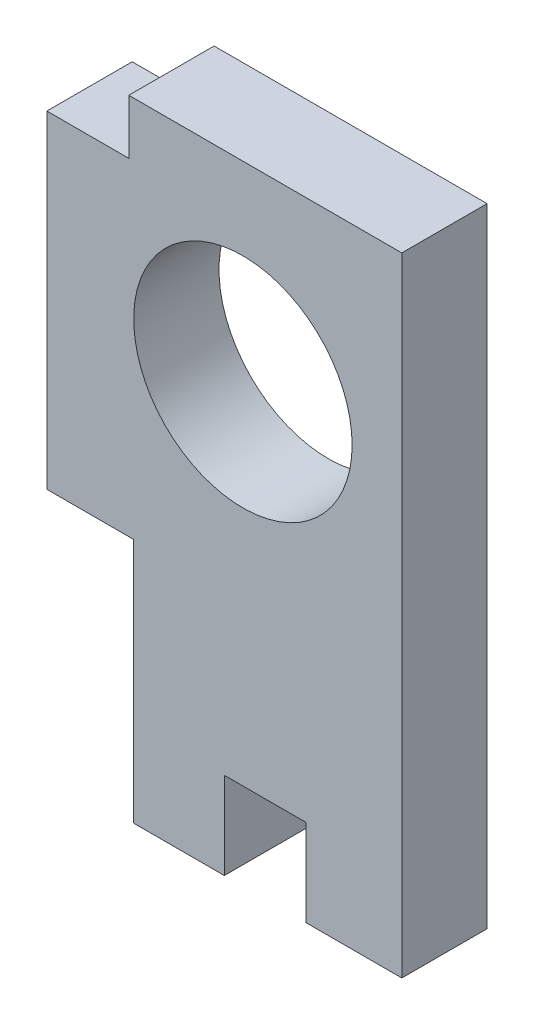
ISO-10303-21;
HEADER;
FILE_DESCRIPTION(('STEP AP214'),'2;1');
FILE_NAME('part.step','',(''),(''),'','','');
FILE_SCHEMA(('AUTOMOTIVE_DESIGN { 1 0 10303 214 1 1 1 1 }'));
ENDSEC;
DATA;
#1=APPLICATION_CONTEXT('core data for automotive mechanical design processes');
#2=APPLICATION_PROTOCOL_DEFINITION('international standard','automotive_design',2000,#1);
#3=PRODUCT_CONTEXT('',#1,'mechanical');
#4=PRODUCT('Part','Part','',(#3));
#5=PRODUCT_RELATED_PRODUCT_CATEGORY('part','',(#4));
#6=PRODUCT_DEFINITION_FORMATION('','',#4);
#7=PRODUCT_DEFINITION_CONTEXT('part definition',#1,'design');
#8=PRODUCT_DEFINITION('design','',#6,#7);
#9=PRODUCT_DEFINITION_SHAPE('','',#8);
#10=(LENGTH_UNIT() NAMED_UNIT(*) SI_UNIT(.MILLI.,.METRE.));
#11=(NAMED_UNIT(*) PLANE_ANGLE_UNIT() SI_UNIT($,.RADIAN.));
#12=(NAMED_UNIT(*) SI_UNIT($,.STERADIAN.) SOLID_ANGLE_UNIT());
#13=UNCERTAINTY_MEASURE_WITH_UNIT(LENGTH_MEASURE(1.E-05),#10,'distance_accuracy_value','');
#14=(GEOMETRIC_REPRESENTATION_CONTEXT(3) GLOBAL_UNCERTAINTY_ASSIGNED_CONTEXT((#13)) GLOBAL_UNIT_ASSIGNED_CONTEXT((#10,
#11,#12)) REPRESENTATION_CONTEXT('',''));
#15=CARTESIAN_POINT('',(0.,0.,0.));
#16=DIRECTION('',(0.,0.,1.));
#17=DIRECTION('',(1.,0.,0.));
#18=AXIS2_PLACEMENT_3D('',#15,#16,#17);
#19=CARTESIAN_POINT('',(0.,0.,3.125));
#20=DIRECTION('',(0.,0.,-1.));
#21=DIRECTION('',(-1.,0.,0.));
#22=AXIS2_PLACEMENT_3D('',#19,#20,#21);
#23=PLANE('',#22);
#24=DIRECTION('',(1.,0.,0.));
#25=VECTOR('',#24,1.);
#26=CARTESIAN_POINT('',(13.,-11.5,3.125));
#27=LINE('',#26,#25);
#28=CARTESIAN_POINT('',(9.5,-11.5,3.125));
#29=VERTEX_POINT('',#28);
#30=CARTESIAN_POINT('',(13.,-11.5,3.125));
#31=VERTEX_POINT('',#30);
#32=EDGE_CURVE('E200',#29,#31,#27,.T.);
#33=ORIENTED_EDGE('',*,*,#32,.T.);
#34=DIRECTION('',(0.,1.,0.));
#35=VECTOR('',#34,1.);
#36=CARTESIAN_POINT('',(13.,11.5,3.125));
#37=LINE('',#36,#35);
#38=CARTESIAN_POINT('',(13.,11.5,3.125));
#39=VERTEX_POINT('',#38);
#40=EDGE_CURVE('E112',#31,#39,#37,.T.);
#41=ORIENTED_EDGE('',*,*,#40,.T.);
#42=DIRECTION('',(-1.,0.,0.));
#43=VECTOR('',#42,1.);
#44=CARTESIAN_POINT('',(2.99999999999999,11.5,3.125));
#45=LINE('',#44,#43);
#46=CARTESIAN_POINT('',(2.99999999999999,11.5,3.125));
#47=VERTEX_POINT('',#46);
#48=EDGE_CURVE('E237',#39,#47,#45,.T.);
#49=ORIENTED_EDGE('',*,*,#48,.T.);
#50=DIRECTION('',(0.,-1.,0.));
#51=VECTOR('',#50,1.);
#52=CARTESIAN_POINT('',(2.99999999999999,9.5,3.125));
#53=LINE('',#52,#51);
#54=CARTESIAN_POINT('',(2.99999999999999,9.5,3.125));
#55=VERTEX_POINT('',#54);
#56=EDGE_CURVE('E257',#47,#55,#53,.T.);
#57=ORIENTED_EDGE('',*,*,#56,.T.);
#58=DIRECTION('',(-1.,0.,0.));
#59=VECTOR('',#58,1.);
#60=CARTESIAN_POINT('',(0.,9.5,3.125));
#61=LINE('',#60,#59);
#62=CARTESIAN_POINT('',(0.,9.5,3.125));
#63=VERTEX_POINT('',#62);
#64=EDGE_CURVE('E253',#55,#63,#61,.T.);
#65=ORIENTED_EDGE('',*,*,#64,.T.);
#66=DIRECTION('',(0.,-1.,0.));
#67=VECTOR('',#66,1.);
#68=CARTESIAN_POINT('',(0.,9.5,3.125));
#69=LINE('',#68,#67);
#70=CARTESIAN_POINT('',(0.,-2.5,3.125));
#71=VERTEX_POINT('',#70);
#72=EDGE_CURVE('E256',#63,#71,#69,.T.);
#73=ORIENTED_EDGE('',*,*,#72,.T.);
#74=DIRECTION('',(1.,0.,0.));
#75=VECTOR('',#74,1.);
#76=CARTESIAN_POINT('',(3.18,-2.5,3.125));
#77=LINE('',#76,#75);
#78=CARTESIAN_POINT('',(3.18,-2.5,3.125));
#79=VERTEX_POINT('',#78);
#80=EDGE_CURVE('E261',#71,#79,#77,.T.);
#81=ORIENTED_EDGE('',*,*,#80,.T.);
#82=DIRECTION('',(0.,-1.,0.));
#83=VECTOR('',#82,1.);
#84=CARTESIAN_POINT('',(3.18,-11.5,3.125));
#85=LINE('',#84,#83);
#86=CARTESIAN_POINT('',(3.18,-11.5,3.125));
#87=VERTEX_POINT('',#86);
#88=EDGE_CURVE('E268',#79,#87,#85,.T.);
#89=ORIENTED_EDGE('',*,*,#88,.T.);
#90=DIRECTION('',(1.,0.,0.));
#91=VECTOR('',#90,1.);
#92=CARTESIAN_POINT('',(6.5,-11.5,3.125));
#93=LINE('',#92,#91);
#94=CARTESIAN_POINT('',(6.5,-11.5,3.125));
#95=VERTEX_POINT('',#94);
#96=EDGE_CURVE('E143',#87,#95,#93,.T.);
#97=ORIENTED_EDGE('',*,*,#96,.T.);
#98=DIRECTION('',(0.,1.,0.));
#99=VECTOR('',#98,1.);
#100=CARTESIAN_POINT('',(6.5,-8.32,3.125));
#101=LINE('',#100,#99);
#102=CARTESIAN_POINT('',(6.5,-8.32,3.125));
#103=VERTEX_POINT('',#102);
#104=EDGE_CURVE('E137',#95,#103,#101,.T.);
#105=ORIENTED_EDGE('',*,*,#104,.T.);
#106=DIRECTION('',(1.,0.,0.));
#107=VECTOR('',#106,1.);
#108=CARTESIAN_POINT('',(9.5,-8.32,3.125));
#109=LINE('',#108,#107);
#110=CARTESIAN_POINT('',(9.5,-8.32,3.125));
#111=VERTEX_POINT('',#110);
#112=EDGE_CURVE('E141',#103,#111,#109,.T.);
#113=ORIENTED_EDGE('',*,*,#112,.T.);
#114=DIRECTION('',(0.,-1.,0.));
#115=VECTOR('',#114,1.);
#116=CARTESIAN_POINT('',(9.5,-11.5,3.125));
#117=LINE('',#116,#115);
#118=EDGE_CURVE('E57',#111,#29,#117,.T.);
#119=ORIENTED_EDGE('',*,*,#118,.T.);
#120=EDGE_LOOP('',(#33,#41,#49,#57,#65,#73,#81,#89,#97,#105,#113,#119));
#121=FACE_BOUND('',#120,.T.);
#122=CARTESIAN_POINT('',(7.18,4.5,3.125));
#123=DIRECTION('',(0.,0.,1.));
#124=DIRECTION('',(1.,0.,0.));
#125=AXIS2_PLACEMENT_3D('',#122,#123,#124);
#126=CIRCLE('',#125,4.);
#127=CARTESIAN_POINT('',(11.18,4.5,3.125));
#128=VERTEX_POINT('',#127);
#129=EDGE_CURVE('E170',#128,#128,#126,.T.);
#130=ORIENTED_EDGE('',*,*,#129,.F.);
#131=EDGE_LOOP('',(#130));
#132=FACE_BOUND('',#131,.T.);
#133=ADVANCED_FACE('F39',(#121,#132),#23,.F.);
#134=CARTESIAN_POINT('',(0.,0.,0.));
#135=DIRECTION('',(0.,0.,-1.));
#136=DIRECTION('',(-1.,0.,0.));
#137=AXIS2_PLACEMENT_3D('',#134,#135,#136);
#138=PLANE('',#137);
#139=DIRECTION('',(1.,0.,0.));
#140=VECTOR('',#139,1.);
#141=CARTESIAN_POINT('',(13.,-11.5,0.));
#142=LINE('',#141,#140);
#143=CARTESIAN_POINT('',(9.5,-11.5,0.));
#144=VERTEX_POINT('',#143);
#145=CARTESIAN_POINT('',(13.,-11.5,0.));
#146=VERTEX_POINT('',#145);
#147=EDGE_CURVE('E165',#144,#146,#142,.T.);
#148=ORIENTED_EDGE('',*,*,#147,.F.);
#149=DIRECTION('',(0.,-1.,0.));
#150=VECTOR('',#149,1.);
#151=CARTESIAN_POINT('',(9.5,-11.5,0.));
#152=LINE('',#151,#150);
#153=CARTESIAN_POINT('',(9.5,-8.32,0.));
#154=VERTEX_POINT('',#153);
#155=EDGE_CURVE('E104',#154,#144,#152,.T.);
#156=ORIENTED_EDGE('',*,*,#155,.F.);
#157=DIRECTION('',(1.,0.,0.));
#158=VECTOR('',#157,1.);
#159=CARTESIAN_POINT('',(9.5,-8.32,0.));
#160=LINE('',#159,#158);
#161=CARTESIAN_POINT('',(6.5,-8.32,0.));
#162=VERTEX_POINT('',#161);
#163=EDGE_CURVE('E98',#162,#154,#160,.T.);
#164=ORIENTED_EDGE('',*,*,#163,.F.);
#165=DIRECTION('',(0.,1.,0.));
#166=VECTOR('',#165,1.);
#167=CARTESIAN_POINT('',(6.5,-8.32,0.));
#168=LINE('',#167,#166);
#169=CARTESIAN_POINT('',(6.5,-11.5,0.));
#170=VERTEX_POINT('',#169);
#171=EDGE_CURVE('E152',#170,#162,#168,.T.);
#172=ORIENTED_EDGE('',*,*,#171,.F.);
#173=DIRECTION('',(1.,0.,0.));
#174=VECTOR('',#173,1.);
#175=CARTESIAN_POINT('',(6.5,-11.5,0.));
#176=LINE('',#175,#174);
#177=CARTESIAN_POINT('',(3.18,-11.5,0.));
#178=VERTEX_POINT('',#177);
#179=EDGE_CURVE('E191',#178,#170,#176,.T.);
#180=ORIENTED_EDGE('',*,*,#179,.F.);
#181=DIRECTION('',(0.,-1.,0.));
#182=VECTOR('',#181,1.);
#183=CARTESIAN_POINT('',(3.18,-11.5,0.));
#184=LINE('',#183,#182);
#185=CARTESIAN_POINT('',(3.18,-2.5,0.));
#186=VERTEX_POINT('',#185);
#187=EDGE_CURVE('E188',#186,#178,#184,.T.);
#188=ORIENTED_EDGE('',*,*,#187,.F.);
#189=DIRECTION('',(1.,0.,0.));
#190=VECTOR('',#189,1.);
#191=CARTESIAN_POINT('',(3.18,-2.5,0.));
#192=LINE('',#191,#190);
#193=CARTESIAN_POINT('',(0.,-2.5,0.));
#194=VERTEX_POINT('',#193);
#195=EDGE_CURVE('E185',#194,#186,#192,.T.);
#196=ORIENTED_EDGE('',*,*,#195,.F.);
#197=DIRECTION('',(0.,-1.,0.));
#198=VECTOR('',#197,1.);
#199=CARTESIAN_POINT('',(0.,9.5,0.));
#200=LINE('',#199,#198);
#201=CARTESIAN_POINT('',(0.,9.5,0.));
#202=VERTEX_POINT('',#201);
#203=EDGE_CURVE('E182',#202,#194,#200,.T.);
#204=ORIENTED_EDGE('',*,*,#203,.F.);
#205=DIRECTION('',(-1.,0.,0.));
#206=VECTOR('',#205,1.);
#207=CARTESIAN_POINT('',(0.,9.5,0.));
#208=LINE('',#207,#206);
#209=CARTESIAN_POINT('',(2.99999999999999,9.5,0.));
#210=VERTEX_POINT('',#209);
#211=EDGE_CURVE('E179',#210,#202,#208,.T.);
#212=ORIENTED_EDGE('',*,*,#211,.F.);
#213=DIRECTION('',(0.,-1.,0.));
#214=VECTOR('',#213,1.);
#215=CARTESIAN_POINT('',(2.99999999999999,9.5,0.));
#216=LINE('',#215,#214);
#217=CARTESIAN_POINT('',(2.99999999999999,11.5,0.));
#218=VERTEX_POINT('',#217);
#219=EDGE_CURVE('E176',#218,#210,#216,.T.);
#220=ORIENTED_EDGE('',*,*,#219,.F.);
#221=DIRECTION('',(-1.,0.,0.));
#222=VECTOR('',#221,1.);
#223=CARTESIAN_POINT('',(2.99999999999999,11.5,0.));
#224=LINE('',#223,#222);
#225=CARTESIAN_POINT('',(13.,11.5,0.));
#226=VERTEX_POINT('',#225);
#227=EDGE_CURVE('E173',#226,#218,#224,.T.);
#228=ORIENTED_EDGE('',*,*,#227,.F.);
#229=DIRECTION('',(0.,1.,0.));
#230=VECTOR('',#229,1.);
#231=CARTESIAN_POINT('',(13.,11.5,0.));
#232=LINE('',#231,#230);
#233=EDGE_CURVE('E169',#146,#226,#232,.T.);
#234=ORIENTED_EDGE('',*,*,#233,.F.);
#235=EDGE_LOOP('',(#148,#156,#164,#172,#180,#188,#196,#204,#212,#220,#228,#234));
#236=FACE_BOUND('',#235,.T.);
#237=CARTESIAN_POINT('',(7.18,4.5,0.));
#238=DIRECTION('',(0.,0.,1.));
#239=DIRECTION('',(1.,0.,0.));
#240=AXIS2_PLACEMENT_3D('',#237,#238,#239);
#241=CIRCLE('',#240,4.);
#242=CARTESIAN_POINT('',(11.18,4.5,0.));
#243=VERTEX_POINT('',#242);
#244=EDGE_CURVE('E417',#243,#243,#241,.T.);
#245=ORIENTED_EDGE('',*,*,#244,.T.);
#246=EDGE_LOOP('',(#245));
#247=FACE_BOUND('',#246,.T.);
#248=ADVANCED_FACE('F241',(#236,#247),#138,.T.);
#249=CARTESIAN_POINT('',(13.,-11.5,3.125));
#250=DIRECTION('',(0.,1.,0.));
#251=DIRECTION('',(-1.,0.,0.));
#252=AXIS2_PLACEMENT_3D('',#249,#250,#251);
#253=PLANE('',#252);
#254=ORIENTED_EDGE('',*,*,#147,.T.);
#255=DIRECTION('',(0.,0.,-1.));
#256=VECTOR('',#255,1.);
#257=CARTESIAN_POINT('',(13.,-11.5,3.125));
#258=LINE('',#257,#256);
#259=EDGE_CURVE('E11',#31,#146,#258,.T.);
#260=ORIENTED_EDGE('',*,*,#259,.F.);
#261=ORIENTED_EDGE('',*,*,#32,.F.);
#262=DIRECTION('',(0.,0.,-1.));
#263=VECTOR('',#262,1.);
#264=CARTESIAN_POINT('',(9.5,-11.5,3.125));
#265=LINE('',#264,#263);
#266=EDGE_CURVE('E161',#29,#144,#265,.T.);
#267=ORIENTED_EDGE('',*,*,#266,.T.);
#268=EDGE_LOOP('',(#254,#260,#261,#267));
#269=FACE_BOUND('',#268,.T.);
#270=ADVANCED_FACE('F41',(#269),#253,.F.);
#271=CARTESIAN_POINT('',(13.,11.5,3.125));
#272=DIRECTION('',(-1.,0.,0.));
#273=DIRECTION('',(0.,-1.,0.));
#274=AXIS2_PLACEMENT_3D('',#271,#272,#273);
#275=PLANE('',#274);
#276=ORIENTED_EDGE('',*,*,#233,.T.);
#277=DIRECTION('',(0.,0.,-1.));
#278=VECTOR('',#277,1.);
#279=CARTESIAN_POINT('',(13.,11.5,3.125));
#280=LINE('',#279,#278);
#281=EDGE_CURVE('E49',#39,#226,#280,.T.);
#282=ORIENTED_EDGE('',*,*,#281,.F.);
#283=ORIENTED_EDGE('',*,*,#40,.F.);
#284=ORIENTED_EDGE('',*,*,#259,.T.);
#285=EDGE_LOOP('',(#276,#282,#283,#284));
#286=FACE_BOUND('',#285,.T.);
#287=ADVANCED_FACE('F304',(#286),#275,.F.);
#288=CARTESIAN_POINT('',(2.99999999999999,11.5,3.125));
#289=DIRECTION('',(0.,-1.,0.));
#290=DIRECTION('',(1.,0.,0.));
#291=AXIS2_PLACEMENT_3D('',#288,#289,#290);
#292=PLANE('',#291);
#293=ORIENTED_EDGE('',*,*,#227,.T.);
#294=DIRECTION('',(0.,0.,-1.));
#295=VECTOR('',#294,1.);
#296=CARTESIAN_POINT('',(2.99999999999999,11.5,3.125));
#297=LINE('',#296,#295);
#298=EDGE_CURVE('E227',#47,#218,#297,.T.);
#299=ORIENTED_EDGE('',*,*,#298,.F.);
#300=ORIENTED_EDGE('',*,*,#48,.F.);
#301=ORIENTED_EDGE('',*,*,#281,.T.);
#302=EDGE_LOOP('',(#293,#299,#300,#301));
#303=FACE_BOUND('',#302,.T.);
#304=ADVANCED_FACE('F235',(#303),#292,.F.);
#305=CARTESIAN_POINT('',(2.99999999999999,9.5,3.125));
#306=DIRECTION('',(1.,0.,0.));
#307=DIRECTION('',(0.,1.,0.));
#308=AXIS2_PLACEMENT_3D('',#305,#306,#307);
#309=PLANE('',#308);
#310=ORIENTED_EDGE('',*,*,#219,.T.);
#311=DIRECTION('',(0.,0.,-1.));
#312=VECTOR('',#311,1.);
#313=CARTESIAN_POINT('',(2.99999999999999,9.5,3.125));
#314=LINE('',#313,#312);
#315=EDGE_CURVE('E223',#55,#210,#314,.T.);
#316=ORIENTED_EDGE('',*,*,#315,.F.);
#317=ORIENTED_EDGE('',*,*,#56,.F.);
#318=ORIENTED_EDGE('',*,*,#298,.T.);
#319=EDGE_LOOP('',(#310,#316,#317,#318));
#320=FACE_BOUND('',#319,.T.);
#321=ADVANCED_FACE('F247',(#320),#309,.F.);
#322=CARTESIAN_POINT('',(0.,9.5,3.125));
#323=DIRECTION('',(0.,-1.,0.));
#324=DIRECTION('',(0.,0.,-1.));
#325=AXIS2_PLACEMENT_3D('',#322,#323,#324);
#326=PLANE('',#325);
#327=ORIENTED_EDGE('',*,*,#211,.T.);
#328=DIRECTION('',(0.,0.,-1.));
#329=VECTOR('',#328,1.);
#330=CARTESIAN_POINT('',(0.,9.5,3.125));
#331=LINE('',#330,#329);
#332=EDGE_CURVE('E219',#63,#202,#331,.T.);
#333=ORIENTED_EDGE('',*,*,#332,.F.);
#334=ORIENTED_EDGE('',*,*,#64,.F.);
#335=ORIENTED_EDGE('',*,*,#315,.T.);
#336=EDGE_LOOP('',(#327,#333,#334,#335));
#337=FACE_BOUND('',#336,.T.);
#338=ADVANCED_FACE('F251',(#337),#326,.F.);
#339=CARTESIAN_POINT('',(0.,9.5,3.125));
#340=DIRECTION('',(1.,0.,0.));
#341=DIRECTION('',(0.,1.,0.));
#342=AXIS2_PLACEMENT_3D('',#339,#340,#341);
#343=PLANE('',#342);
#344=ORIENTED_EDGE('',*,*,#203,.T.);
#345=DIRECTION('',(0.,0.,-1.));
#346=VECTOR('',#345,1.);
#347=CARTESIAN_POINT('',(0.,-2.5,3.125));
#348=LINE('',#347,#346);
#349=EDGE_CURVE('E215',#71,#194,#348,.T.);
#350=ORIENTED_EDGE('',*,*,#349,.F.);
#351=ORIENTED_EDGE('',*,*,#72,.F.);
#352=ORIENTED_EDGE('',*,*,#332,.T.);
#353=EDGE_LOOP('',(#344,#350,#351,#352));
#354=FACE_BOUND('',#353,.T.);
#355=ADVANCED_FACE('F317',(#354),#343,.F.);
#356=CARTESIAN_POINT('',(3.18,-2.5,3.125));
#357=DIRECTION('',(0.,1.,0.));
#358=DIRECTION('',(-1.,0.,0.));
#359=AXIS2_PLACEMENT_3D('',#356,#357,#358);
#360=PLANE('',#359);
#361=ORIENTED_EDGE('',*,*,#195,.T.);
#362=DIRECTION('',(0.,0.,-1.));
#363=VECTOR('',#362,1.);
#364=CARTESIAN_POINT('',(3.18,-2.5,3.125));
#365=LINE('',#364,#363);
#366=EDGE_CURVE('E211',#79,#186,#365,.T.);
#367=ORIENTED_EDGE('',*,*,#366,.F.);
#368=ORIENTED_EDGE('',*,*,#80,.F.);
#369=ORIENTED_EDGE('',*,*,#349,.T.);
#370=EDGE_LOOP('',(#361,#367,#368,#369));
#371=FACE_BOUND('',#370,.T.);
#372=ADVANCED_FACE('F320',(#371),#360,.F.);
#373=CARTESIAN_POINT('',(3.18,-11.5,3.125));
#374=DIRECTION('',(1.,0.,0.));
#375=DIRECTION('',(0.,1.,0.));
#376=AXIS2_PLACEMENT_3D('',#373,#374,#375);
#377=PLANE('',#376);
#378=ORIENTED_EDGE('',*,*,#187,.T.);
#379=DIRECTION('',(0.,0.,-1.));
#380=VECTOR('',#379,1.);
#381=CARTESIAN_POINT('',(3.18,-11.5,3.125));
#382=LINE('',#381,#380);
#383=EDGE_CURVE('E207',#87,#178,#382,.T.);
#384=ORIENTED_EDGE('',*,*,#383,.F.);
#385=ORIENTED_EDGE('',*,*,#88,.F.);
#386=ORIENTED_EDGE('',*,*,#366,.T.);
#387=EDGE_LOOP('',(#378,#384,#385,#386));
#388=FACE_BOUND('',#387,.T.);
#389=ADVANCED_FACE('F276',(#388),#377,.F.);
#390=CARTESIAN_POINT('',(6.5,-11.5,3.125));
#391=DIRECTION('',(0.,1.,0.));
#392=DIRECTION('',(-1.,0.,0.));
#393=AXIS2_PLACEMENT_3D('',#390,#391,#392);
#394=PLANE('',#393);
#395=ORIENTED_EDGE('',*,*,#179,.T.);
#396=DIRECTION('',(0.,0.,-1.));
#397=VECTOR('',#396,1.);
#398=CARTESIAN_POINT('',(6.5,-11.5,3.125));
#399=LINE('',#398,#397);
#400=EDGE_CURVE('E154',#95,#170,#399,.T.);
#401=ORIENTED_EDGE('',*,*,#400,.F.);
#402=ORIENTED_EDGE('',*,*,#96,.F.);
#403=ORIENTED_EDGE('',*,*,#383,.T.);
#404=EDGE_LOOP('',(#395,#401,#402,#403));
#405=FACE_BOUND('',#404,.T.);
#406=ADVANCED_FACE('F280',(#405),#394,.F.);
#407=CARTESIAN_POINT('',(6.5,-8.32,3.125));
#408=DIRECTION('',(-1.,0.,0.));
#409=DIRECTION('',(0.,0.,1.));
#410=AXIS2_PLACEMENT_3D('',#407,#408,#409);
#411=PLANE('',#410);
#412=ORIENTED_EDGE('',*,*,#171,.T.);
#413=DIRECTION('',(0.,0.,-1.));
#414=VECTOR('',#413,1.);
#415=CARTESIAN_POINT('',(6.5,-8.32,3.125));
#416=LINE('',#415,#414);
#417=EDGE_CURVE('E149',#103,#162,#416,.T.);
#418=ORIENTED_EDGE('',*,*,#417,.F.);
#419=ORIENTED_EDGE('',*,*,#104,.F.);
#420=ORIENTED_EDGE('',*,*,#400,.T.);
#421=EDGE_LOOP('',(#412,#418,#419,#420));
#422=FACE_BOUND('',#421,.T.);
#423=ADVANCED_FACE('F150',(#422),#411,.F.);
#424=CARTESIAN_POINT('',(9.5,-8.32,3.125));
#425=DIRECTION('',(0.,1.,0.));
#426=DIRECTION('',(0.,0.,1.));
#427=AXIS2_PLACEMENT_3D('',#424,#425,#426);
#428=PLANE('',#427);
#429=ORIENTED_EDGE('',*,*,#163,.T.);
#430=DIRECTION('',(0.,0.,-1.));
#431=VECTOR('',#430,1.);
#432=CARTESIAN_POINT('',(9.5,-8.32,3.125));
#433=LINE('',#432,#431);
#434=EDGE_CURVE('E155',#111,#154,#433,.T.);
#435=ORIENTED_EDGE('',*,*,#434,.F.);
#436=ORIENTED_EDGE('',*,*,#112,.F.);
#437=ORIENTED_EDGE('',*,*,#417,.T.);
#438=EDGE_LOOP('',(#429,#435,#436,#437));
#439=FACE_BOUND('',#438,.T.);
#440=ADVANCED_FACE('F157',(#439),#428,.F.);
#441=CARTESIAN_POINT('',(9.5,-11.5,3.125));
#442=DIRECTION('',(1.,0.,0.));
#443=DIRECTION('',(0.,0.,-1.));
#444=AXIS2_PLACEMENT_3D('',#441,#442,#443);
#445=PLANE('',#444);
#446=ORIENTED_EDGE('',*,*,#155,.T.);
#447=ORIENTED_EDGE('',*,*,#266,.F.);
#448=ORIENTED_EDGE('',*,*,#118,.F.);
#449=ORIENTED_EDGE('',*,*,#434,.T.);
#450=EDGE_LOOP('',(#446,#447,#448,#449));
#451=FACE_BOUND('',#450,.T.);
#452=ADVANCED_FACE('F284',(#451),#445,.F.);
#453=CARTESIAN_POINT('',(7.18,4.5,3.125));
#454=DIRECTION('',(0.,0.,-1.));
#455=DIRECTION('',(-1.,0.,0.));
#456=AXIS2_PLACEMENT_3D('',#453,#454,#455);
#457=CYLINDRICAL_SURFACE('',#456,4.);
#458=ORIENTED_EDGE('',*,*,#129,.T.);
#459=EDGE_LOOP('',(#458));
#460=FACE_BOUND('',#459,.T.);
#461=ORIENTED_EDGE('',*,*,#244,.F.);
#462=EDGE_LOOP('',(#461));
#463=FACE_BOUND('',#462,.T.);
#464=ADVANCED_FACE('F286',(#460,#463),#457,.F.);
#465=CLOSED_SHELL('',(#133,#248,#270,#287,#304,#321,#338,#355,#372,#389,#406,#423,#440,#452,#464));
#466=MANIFOLD_SOLID_BREP('B2',#465);
#467=ADVANCED_BREP_SHAPE_REPRESENTATION('',(#18,#466),#14);
#468=SHAPE_DEFINITION_REPRESENTATION(#9,#467);
ENDSEC;
END-ISO-10303-21;
